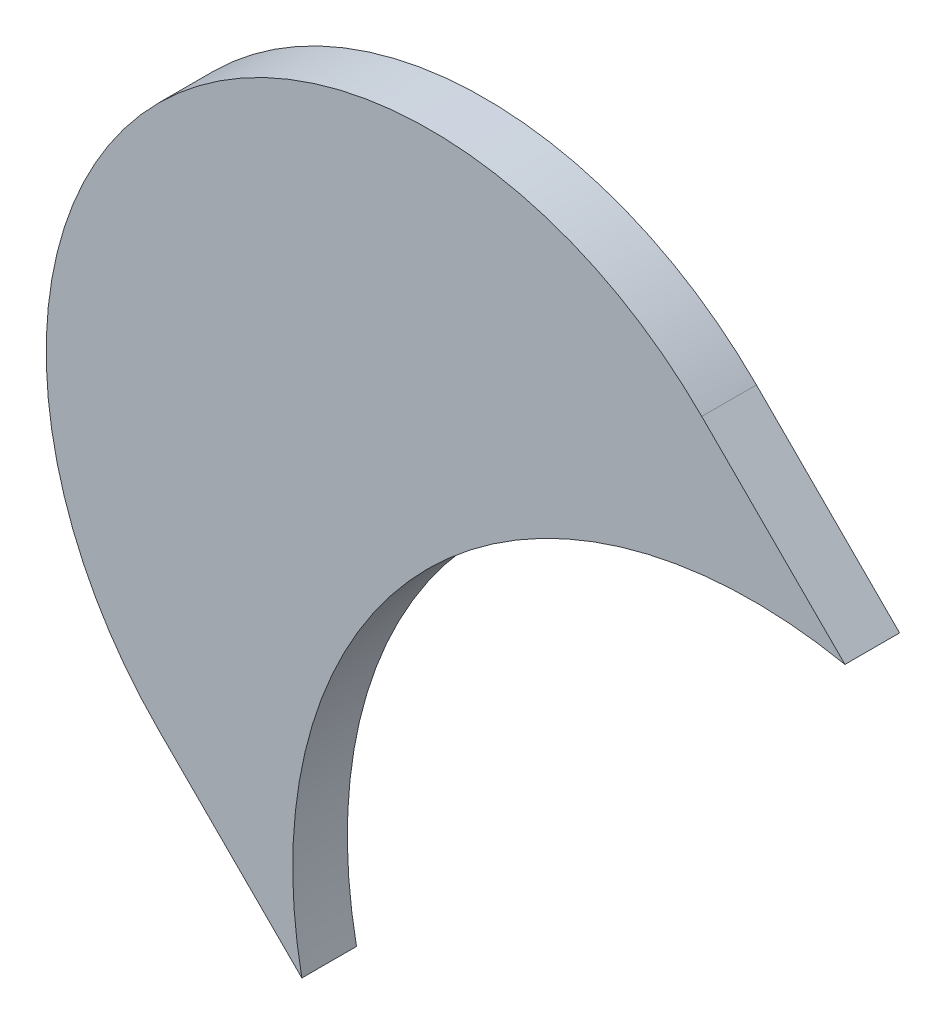
ISO-10303-21;
HEADER;
FILE_DESCRIPTION(('STEP AP214'),'2;1');
FILE_NAME('part.step','',(''),(''),'','','');
FILE_SCHEMA(('AUTOMOTIVE_DESIGN { 1 0 10303 214 1 1 1 1 }'));
ENDSEC;
DATA;
#1=APPLICATION_CONTEXT('core data for automotive mechanical design processes');
#2=APPLICATION_PROTOCOL_DEFINITION('international standard','automotive_design',2000,#1);
#3=PRODUCT_CONTEXT('',#1,'mechanical');
#4=PRODUCT('Part','Part','',(#3));
#5=PRODUCT_RELATED_PRODUCT_CATEGORY('part','',(#4));
#6=PRODUCT_DEFINITION_FORMATION('','',#4);
#7=PRODUCT_DEFINITION_CONTEXT('part definition',#1,'design');
#8=PRODUCT_DEFINITION('design','',#6,#7);
#9=PRODUCT_DEFINITION_SHAPE('','',#8);
#10=(LENGTH_UNIT() NAMED_UNIT(*) SI_UNIT(.MILLI.,.METRE.));
#11=(NAMED_UNIT(*) PLANE_ANGLE_UNIT() SI_UNIT($,.RADIAN.));
#12=(NAMED_UNIT(*) SI_UNIT($,.STERADIAN.) SOLID_ANGLE_UNIT());
#13=UNCERTAINTY_MEASURE_WITH_UNIT(LENGTH_MEASURE(1.E-05),#10,'distance_accuracy_value','');
#14=(GEOMETRIC_REPRESENTATION_CONTEXT(3) GLOBAL_UNCERTAINTY_ASSIGNED_CONTEXT((#13)) GLOBAL_UNIT_ASSIGNED_CONTEXT((#10,
#11,#12)) REPRESENTATION_CONTEXT('',''));
#15=CARTESIAN_POINT('',(0.,0.,0.));
#16=DIRECTION('',(0.,0.,1.));
#17=DIRECTION('',(1.,0.,0.));
#18=AXIS2_PLACEMENT_3D('',#15,#16,#17);
#19=CARTESIAN_POINT('',(101.01276978,112.53369924,0.));
#20=DIRECTION('',(0.707106781186571,0.707106781186524,0.));
#21=DIRECTION('',(0.707106781186524,-0.707106781186571,0.));
#22=AXIS2_PLACEMENT_3D('',#19,#20,#21);
#23=PLANE('',#22);
#24=DIRECTION('',(0.707106781186524,-0.707106781186571,0.));
#25=VECTOR('',#24,1.);
#26=CARTESIAN_POINT('',(101.01276978,112.53369924,0.03556));
#27=LINE('',#26,#25);
#28=CARTESIAN_POINT('',(101.01276978,112.53369924,0.03556));
#29=VERTEX_POINT('',#28);
#30=CARTESIAN_POINT('',(101.105984238199,112.4404847818,0.03556));
#31=VERTEX_POINT('',#30);
#32=EDGE_CURVE('E11',#29,#31,#27,.T.);
#33=ORIENTED_EDGE('',*,*,#32,.F.);
#34=DIRECTION('',(0.,0.,1.));
#35=VECTOR('',#34,1.);
#36=CARTESIAN_POINT('',(101.01276978,112.53369924,0.));
#37=LINE('',#36,#35);
#38=CARTESIAN_POINT('',(101.01276978,112.53369924,0.));
#39=VERTEX_POINT('',#38);
#40=EDGE_CURVE('E24',#39,#29,#37,.T.);
#41=ORIENTED_EDGE('',*,*,#40,.F.);
#42=DIRECTION('',(0.707106781186524,-0.707106781186571,0.));
#43=VECTOR('',#42,1.);
#44=CARTESIAN_POINT('',(101.01276978,112.53369924,0.));
#45=LINE('',#44,#43);
#46=CARTESIAN_POINT('',(101.105984238199,112.4404847818,0.));
#47=VERTEX_POINT('',#46);
#48=EDGE_CURVE('E75',#39,#47,#45,.T.);
#49=ORIENTED_EDGE('',*,*,#48,.T.);
#50=DIRECTION('',(0.,0.,1.));
#51=VECTOR('',#50,1.);
#52=CARTESIAN_POINT('',(101.105984238199,112.4404847818,0.));
#53=LINE('',#52,#51);
#54=EDGE_CURVE('E37',#47,#31,#53,.T.);
#55=ORIENTED_EDGE('',*,*,#54,.T.);
#56=EDGE_LOOP('',(#33,#41,#49,#55));
#57=FACE_BOUND('',#56,.T.);
#58=ADVANCED_FACE('F17',(#57),#23,.F.);
#59=CARTESIAN_POINT('',(101.40002072,112.50000106,0.));
#60=DIRECTION('',(0.,0.,-1.));
#61=DIRECTION('',(1.,0.,0.));
#62=AXIS2_PLACEMENT_3D('',#59,#60,#61);
#63=CYLINDRICAL_SURFACE('',#62,0.2999994);
#64=DIRECTION('',(0.,0.,1.));
#65=VECTOR('',#64,1.);
#66=CARTESIAN_POINT('',(101.459536998199,112.7940375418,0.));
#67=LINE('',#66,#65);
#68=CARTESIAN_POINT('',(101.459536998199,112.7940375418,0.));
#69=VERTEX_POINT('',#68);
#70=CARTESIAN_POINT('',(101.459536998199,112.7940375418,0.03556));
#71=VERTEX_POINT('',#70);
#72=EDGE_CURVE('E67',#69,#71,#67,.T.);
#73=ORIENTED_EDGE('',*,*,#72,.T.);
#74=CARTESIAN_POINT('',(101.40002072,112.50000106,0.03556));
#75=DIRECTION('',(0.,0.,1.));
#76=DIRECTION('',(1.,0.,0.));
#77=AXIS2_PLACEMENT_3D('',#74,#75,#76);
#78=CIRCLE('',#77,0.2999994);
#79=EDGE_CURVE('E82',#71,#31,#78,.T.);
#80=ORIENTED_EDGE('',*,*,#79,.T.);
#81=ORIENTED_EDGE('',*,*,#54,.F.);
#82=CARTESIAN_POINT('',(101.40002072,112.50000106,0.));
#83=DIRECTION('',(0.,0.,1.));
#84=DIRECTION('',(1.,0.,0.));
#85=AXIS2_PLACEMENT_3D('',#82,#83,#84);
#86=CIRCLE('',#85,0.2999994);
#87=EDGE_CURVE('E80',#69,#47,#86,.T.);
#88=ORIENTED_EDGE('',*,*,#87,.F.);
#89=EDGE_LOOP('',(#73,#80,#81,#88));
#90=FACE_BOUND('',#89,.T.);
#91=ADVANCED_FACE('F88',(#90),#63,.F.);
#92=CARTESIAN_POINT('',(101.459536998199,112.7940375418,0.));
#93=DIRECTION('',(-0.707106781186571,-0.707106781186524,0.));
#94=DIRECTION('',(-0.707106781186524,0.707106781186571,0.));
#95=AXIS2_PLACEMENT_3D('',#92,#93,#94);
#96=PLANE('',#95);
#97=DIRECTION('',(-0.707106781186524,0.707106781186571,0.));
#98=VECTOR('',#97,1.);
#99=CARTESIAN_POINT('',(101.5767971,112.67677744,0.03556));
#100=LINE('',#99,#98);
#101=CARTESIAN_POINT('',(101.36632254,112.887252,0.03556));
#102=VERTEX_POINT('',#101);
#103=EDGE_CURVE('E71',#71,#102,#100,.T.);
#104=ORIENTED_EDGE('',*,*,#103,.F.);
#105=ORIENTED_EDGE('',*,*,#72,.F.);
#106=DIRECTION('',(-0.707106781186524,0.707106781186571,0.));
#107=VECTOR('',#106,1.);
#108=CARTESIAN_POINT('',(101.5767971,112.67677744,0.));
#109=LINE('',#108,#107);
#110=CARTESIAN_POINT('',(101.36632254,112.887252,0.));
#111=VERTEX_POINT('',#110);
#112=EDGE_CURVE('E63',#69,#111,#109,.T.);
#113=ORIENTED_EDGE('',*,*,#112,.T.);
#114=DIRECTION('',(0.,0.,1.));
#115=VECTOR('',#114,1.);
#116=CARTESIAN_POINT('',(101.36632254,112.887252,0.));
#117=LINE('',#116,#115);
#118=EDGE_CURVE('E53',#111,#102,#117,.T.);
#119=ORIENTED_EDGE('',*,*,#118,.T.);
#120=EDGE_LOOP('',(#104,#105,#113,#119));
#121=FACE_BOUND('',#120,.T.);
#122=ADVANCED_FACE('F66',(#121),#96,.F.);
#123=CARTESIAN_POINT('',(101.18954616,112.71047562,0.));
#124=DIRECTION('',(0.,0.,-1.));
#125=DIRECTION('',(0.707106781186548,0.707106781186548,0.));
#126=AXIS2_PLACEMENT_3D('',#123,#124,#125);
#127=CYLINDRICAL_SURFACE('',#126,0.249999554103223);
#128=CARTESIAN_POINT('',(101.18954616,112.71047562,0.03556));
#129=DIRECTION('',(0.,0.,1.));
#130=DIRECTION('',(0.707106781186548,0.707106781186548,0.));
#131=AXIS2_PLACEMENT_3D('',#128,#129,#130);
#132=CIRCLE('',#131,0.249999554103223);
#133=EDGE_CURVE('E59',#102,#29,#132,.T.);
#134=ORIENTED_EDGE('',*,*,#133,.F.);
#135=ORIENTED_EDGE('',*,*,#118,.F.);
#136=CARTESIAN_POINT('',(101.18954616,112.71047562,0.));
#137=DIRECTION('',(0.,0.,1.));
#138=DIRECTION('',(0.707106781186548,0.707106781186548,0.));
#139=AXIS2_PLACEMENT_3D('',#136,#137,#138);
#140=CIRCLE('',#139,0.249999554103223);
#141=EDGE_CURVE('E57',#111,#39,#140,.T.);
#142=ORIENTED_EDGE('',*,*,#141,.T.);
#143=ORIENTED_EDGE('',*,*,#40,.T.);
#144=EDGE_LOOP('',(#134,#135,#142,#143));
#145=FACE_BOUND('',#144,.T.);
#146=ADVANCED_FACE('F55',(#145),#127,.T.);
#147=CARTESIAN_POINT('',(101.01276978,112.53369924,0.));
#148=DIRECTION('',(0.,0.,-1.));
#149=DIRECTION('',(-1.,0.,0.));
#150=AXIS2_PLACEMENT_3D('',#147,#148,#149);
#151=PLANE('',#150);
#152=ORIENTED_EDGE('',*,*,#48,.F.);
#153=ORIENTED_EDGE('',*,*,#141,.F.);
#154=ORIENTED_EDGE('',*,*,#112,.F.);
#155=ORIENTED_EDGE('',*,*,#87,.T.);
#156=EDGE_LOOP('',(#152,#153,#154,#155));
#157=FACE_BOUND('',#156,.T.);
#158=ADVANCED_FACE('F74',(#157),#151,.T.);
#159=CARTESIAN_POINT('',(101.01276978,112.53369924,0.03556));
#160=DIRECTION('',(0.,0.,-1.));
#161=DIRECTION('',(-1.,0.,0.));
#162=AXIS2_PLACEMENT_3D('',#159,#160,#161);
#163=PLANE('',#162);
#164=ORIENTED_EDGE('',*,*,#133,.T.);
#165=ORIENTED_EDGE('',*,*,#32,.T.);
#166=ORIENTED_EDGE('',*,*,#79,.F.);
#167=ORIENTED_EDGE('',*,*,#103,.T.);
#168=EDGE_LOOP('',(#164,#165,#166,#167));
#169=FACE_BOUND('',#168,.T.);
#170=ADVANCED_FACE('F91',(#169),#163,.F.);
#171=CLOSED_SHELL('',(#58,#91,#122,#146,#158,#170));
#172=MANIFOLD_SOLID_BREP('B1',#171);
#173=ADVANCED_BREP_SHAPE_REPRESENTATION('',(#18,#172),#14);
#174=SHAPE_DEFINITION_REPRESENTATION(#9,#173);
ENDSEC;
END-ISO-10303-21;
